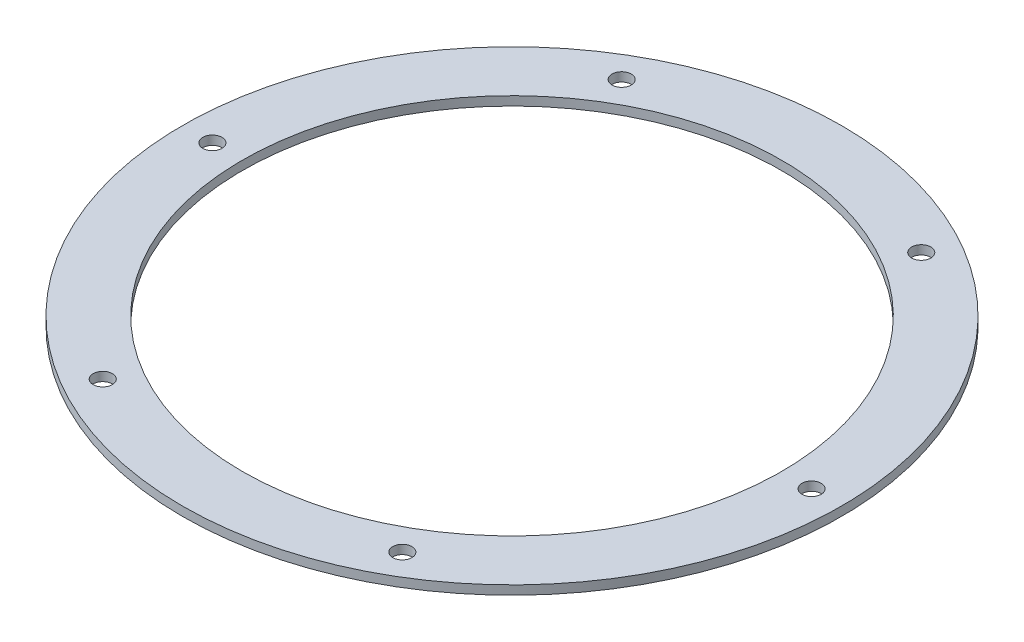
ISO-10303-21;
HEADER;
FILE_DESCRIPTION(('STEP AP214'),'2;1');
FILE_NAME('part.step','',(''),(''),'','','');
FILE_SCHEMA(('AUTOMOTIVE_DESIGN { 1 0 10303 214 1 1 1 1 }'));
ENDSEC;
DATA;
#1=APPLICATION_CONTEXT('core data for automotive mechanical design processes');
#2=APPLICATION_PROTOCOL_DEFINITION('international standard','automotive_design',2000,#1);
#3=PRODUCT_CONTEXT('',#1,'mechanical');
#4=PRODUCT('Part','Part','',(#3));
#5=PRODUCT_RELATED_PRODUCT_CATEGORY('part','',(#4));
#6=PRODUCT_DEFINITION_FORMATION('','',#4);
#7=PRODUCT_DEFINITION_CONTEXT('part definition',#1,'design');
#8=PRODUCT_DEFINITION('design','',#6,#7);
#9=PRODUCT_DEFINITION_SHAPE('','',#8);
#10=(LENGTH_UNIT() NAMED_UNIT(*) SI_UNIT(.MILLI.,.METRE.));
#11=(NAMED_UNIT(*) PLANE_ANGLE_UNIT() SI_UNIT($,.RADIAN.));
#12=(NAMED_UNIT(*) SI_UNIT($,.STERADIAN.) SOLID_ANGLE_UNIT());
#13=UNCERTAINTY_MEASURE_WITH_UNIT(LENGTH_MEASURE(1.E-05),#10,'distance_accuracy_value','');
#14=(GEOMETRIC_REPRESENTATION_CONTEXT(3) GLOBAL_UNCERTAINTY_ASSIGNED_CONTEXT((#13)) GLOBAL_UNIT_ASSIGNED_CONTEXT((#10,
#11,#12)) REPRESENTATION_CONTEXT('',''));
#15=CARTESIAN_POINT('',(0.,0.,0.));
#16=DIRECTION('',(0.,0.,1.));
#17=DIRECTION('',(1.,0.,0.));
#18=AXIS2_PLACEMENT_3D('',#15,#16,#17);
#19=CARTESIAN_POINT('',(0.,1.5,0.));
#20=DIRECTION('',(0.,1.,0.));
#21=DIRECTION('',(0.,0.,1.));
#22=AXIS2_PLACEMENT_3D('',#19,#20,#21);
#23=PLANE('',#22);
#24=CARTESIAN_POINT('',(-25.,1.5,-43.3012701892219));
#25=DIRECTION('',(0.,1.,0.));
#26=DIRECTION('',(0.,0.,1.));
#27=AXIS2_PLACEMENT_3D('',#24,#25,#26);
#28=CIRCLE('',#27,1.6);
#29=CARTESIAN_POINT('',(-25.,1.5,-41.7012701892219));
#30=VERTEX_POINT('',#29);
#31=EDGE_CURVE('E81',#30,#30,#28,.T.);
#32=ORIENTED_EDGE('',*,*,#31,.F.);
#33=EDGE_LOOP('',(#32));
#34=FACE_BOUND('',#33,.T.);
#35=CARTESIAN_POINT('',(-25.,1.5,43.3012701892219));
#36=DIRECTION('',(0.,1.,0.));
#37=DIRECTION('',(0.,0.,1.));
#38=AXIS2_PLACEMENT_3D('',#35,#36,#37);
#39=CIRCLE('',#38,1.6);
#40=CARTESIAN_POINT('',(-25.,1.5,44.9012701892219));
#41=VERTEX_POINT('',#40);
#42=EDGE_CURVE('E69',#41,#41,#39,.T.);
#43=ORIENTED_EDGE('',*,*,#42,.F.);
#44=EDGE_LOOP('',(#43));
#45=FACE_BOUND('',#44,.T.);
#46=CARTESIAN_POINT('',(50.,1.5,0.));
#47=DIRECTION('',(0.,1.,0.));
#48=DIRECTION('',(0.,0.,1.));
#49=AXIS2_PLACEMENT_3D('',#46,#47,#48);
#50=CIRCLE('',#49,1.6);
#51=CARTESIAN_POINT('',(50.,1.5,1.6));
#52=VERTEX_POINT('',#51);
#53=EDGE_CURVE('E57',#52,#52,#50,.T.);
#54=ORIENTED_EDGE('',*,*,#53,.F.);
#55=EDGE_LOOP('',(#54));
#56=FACE_BOUND('',#55,.T.);
#57=CARTESIAN_POINT('',(0.,1.5,0.));
#58=DIRECTION('',(0.,1.,0.));
#59=DIRECTION('',(0.,0.,1.));
#60=AXIS2_PLACEMENT_3D('',#57,#58,#59);
#61=CIRCLE('',#60,55.);
#62=CARTESIAN_POINT('',(0.,1.5,55.));
#63=VERTEX_POINT('',#62);
#64=EDGE_CURVE('E10',#63,#63,#61,.T.);
#65=ORIENTED_EDGE('',*,*,#64,.T.);
#66=EDGE_LOOP('',(#65));
#67=FACE_BOUND('',#66,.T.);
#68=CARTESIAN_POINT('',(0.,1.5,0.));
#69=DIRECTION('',(0.,1.,0.));
#70=DIRECTION('',(0.,0.,1.));
#71=AXIS2_PLACEMENT_3D('',#68,#69,#70);
#72=CIRCLE('',#71,45.);
#73=CARTESIAN_POINT('',(0.,1.5,45.));
#74=VERTEX_POINT('',#73);
#75=EDGE_CURVE('E52',#74,#74,#72,.T.);
#76=ORIENTED_EDGE('',*,*,#75,.F.);
#77=EDGE_LOOP('',(#76));
#78=FACE_BOUND('',#77,.T.);
#79=CARTESIAN_POINT('',(25.,1.5,43.3012701892219));
#80=DIRECTION('',(0.,1.,0.));
#81=DIRECTION('',(0.,0.,1.));
#82=AXIS2_PLACEMENT_3D('',#79,#80,#81);
#83=CIRCLE('',#82,1.6);
#84=CARTESIAN_POINT('',(25.,1.5,44.9012701892219));
#85=VERTEX_POINT('',#84);
#86=EDGE_CURVE('E63',#85,#85,#83,.T.);
#87=ORIENTED_EDGE('',*,*,#86,.F.);
#88=EDGE_LOOP('',(#87));
#89=FACE_BOUND('',#88,.T.);
#90=CARTESIAN_POINT('',(-50.,1.5,0.));
#91=DIRECTION('',(0.,1.,0.));
#92=DIRECTION('',(0.,0.,1.));
#93=AXIS2_PLACEMENT_3D('',#90,#91,#92);
#94=CIRCLE('',#93,1.6);
#95=CARTESIAN_POINT('',(-50.,1.5,1.59999999999999));
#96=VERTEX_POINT('',#95);
#97=EDGE_CURVE('E75',#96,#96,#94,.T.);
#98=ORIENTED_EDGE('',*,*,#97,.F.);
#99=EDGE_LOOP('',(#98));
#100=FACE_BOUND('',#99,.T.);
#101=CARTESIAN_POINT('',(25.,1.5,-43.3012701892219));
#102=DIRECTION('',(0.,1.,0.));
#103=DIRECTION('',(0.,0.,1.));
#104=AXIS2_PLACEMENT_3D('',#101,#102,#103);
#105=CIRCLE('',#104,1.6);
#106=CARTESIAN_POINT('',(25.,1.5,-41.7012701892219));
#107=VERTEX_POINT('',#106);
#108=EDGE_CURVE('E87',#107,#107,#105,.T.);
#109=ORIENTED_EDGE('',*,*,#108,.F.);
#110=EDGE_LOOP('',(#109));
#111=FACE_BOUND('',#110,.T.);
#112=ADVANCED_FACE('F41',(#34,#45,#56,#67,#78,#89,#100,#111),#23,.T.);
#113=CARTESIAN_POINT('',(0.,0.,0.));
#114=DIRECTION('',(0.,1.,0.));
#115=DIRECTION('',(0.,0.,1.));
#116=AXIS2_PLACEMENT_3D('',#113,#114,#115);
#117=PLANE('',#116);
#118=CARTESIAN_POINT('',(0.,0.,0.));
#119=DIRECTION('',(0.,1.,0.));
#120=DIRECTION('',(0.,0.,1.));
#121=AXIS2_PLACEMENT_3D('',#118,#119,#120);
#122=CIRCLE('',#121,55.);
#123=CARTESIAN_POINT('',(0.,0.,55.));
#124=VERTEX_POINT('',#123);
#125=EDGE_CURVE('E45',#124,#124,#122,.T.);
#126=ORIENTED_EDGE('',*,*,#125,.F.);
#127=EDGE_LOOP('',(#126));
#128=FACE_BOUND('',#127,.T.);
#129=CARTESIAN_POINT('',(0.,0.,0.));
#130=DIRECTION('',(0.,1.,0.));
#131=DIRECTION('',(0.,0.,1.));
#132=AXIS2_PLACEMENT_3D('',#129,#130,#131);
#133=CIRCLE('',#132,45.);
#134=CARTESIAN_POINT('',(0.,0.,45.));
#135=VERTEX_POINT('',#134);
#136=EDGE_CURVE('E54',#135,#135,#133,.T.);
#137=ORIENTED_EDGE('',*,*,#136,.T.);
#138=EDGE_LOOP('',(#137));
#139=FACE_BOUND('',#138,.T.);
#140=CARTESIAN_POINT('',(50.,0.,0.));
#141=DIRECTION('',(0.,1.,0.));
#142=DIRECTION('',(0.,0.,1.));
#143=AXIS2_PLACEMENT_3D('',#140,#141,#142);
#144=CIRCLE('',#143,1.6);
#145=CARTESIAN_POINT('',(50.,0.,1.6));
#146=VERTEX_POINT('',#145);
#147=EDGE_CURVE('E60',#146,#146,#144,.T.);
#148=ORIENTED_EDGE('',*,*,#147,.T.);
#149=EDGE_LOOP('',(#148));
#150=FACE_BOUND('',#149,.T.);
#151=CARTESIAN_POINT('',(25.,0.,43.3012701892219));
#152=DIRECTION('',(0.,1.,0.));
#153=DIRECTION('',(0.,0.,1.));
#154=AXIS2_PLACEMENT_3D('',#151,#152,#153);
#155=CIRCLE('',#154,1.6);
#156=CARTESIAN_POINT('',(25.,0.,44.9012701892219));
#157=VERTEX_POINT('',#156);
#158=EDGE_CURVE('E66',#157,#157,#155,.T.);
#159=ORIENTED_EDGE('',*,*,#158,.T.);
#160=EDGE_LOOP('',(#159));
#161=FACE_BOUND('',#160,.T.);
#162=CARTESIAN_POINT('',(-25.,0.,43.3012701892219));
#163=DIRECTION('',(0.,1.,0.));
#164=DIRECTION('',(0.,0.,1.));
#165=AXIS2_PLACEMENT_3D('',#162,#163,#164);
#166=CIRCLE('',#165,1.6);
#167=CARTESIAN_POINT('',(-25.,0.,44.9012701892219));
#168=VERTEX_POINT('',#167);
#169=EDGE_CURVE('E72',#168,#168,#166,.T.);
#170=ORIENTED_EDGE('',*,*,#169,.T.);
#171=EDGE_LOOP('',(#170));
#172=FACE_BOUND('',#171,.T.);
#173=CARTESIAN_POINT('',(-50.,0.,0.));
#174=DIRECTION('',(0.,1.,0.));
#175=DIRECTION('',(0.,0.,1.));
#176=AXIS2_PLACEMENT_3D('',#173,#174,#175);
#177=CIRCLE('',#176,1.6);
#178=CARTESIAN_POINT('',(-50.,0.,1.59999999999999));
#179=VERTEX_POINT('',#178);
#180=EDGE_CURVE('E78',#179,#179,#177,.T.);
#181=ORIENTED_EDGE('',*,*,#180,.T.);
#182=EDGE_LOOP('',(#181));
#183=FACE_BOUND('',#182,.T.);
#184=CARTESIAN_POINT('',(-25.,0.,-43.3012701892219));
#185=DIRECTION('',(0.,1.,0.));
#186=DIRECTION('',(0.,0.,1.));
#187=AXIS2_PLACEMENT_3D('',#184,#185,#186);
#188=CIRCLE('',#187,1.6);
#189=CARTESIAN_POINT('',(-25.,0.,-41.7012701892219));
#190=VERTEX_POINT('',#189);
#191=EDGE_CURVE('E84',#190,#190,#188,.T.);
#192=ORIENTED_EDGE('',*,*,#191,.T.);
#193=EDGE_LOOP('',(#192));
#194=FACE_BOUND('',#193,.T.);
#195=CARTESIAN_POINT('',(25.,0.,-43.3012701892219));
#196=DIRECTION('',(0.,1.,0.));
#197=DIRECTION('',(0.,0.,1.));
#198=AXIS2_PLACEMENT_3D('',#195,#196,#197);
#199=CIRCLE('',#198,1.6);
#200=CARTESIAN_POINT('',(25.,0.,-41.7012701892219));
#201=VERTEX_POINT('',#200);
#202=EDGE_CURVE('E90',#201,#201,#199,.T.);
#203=ORIENTED_EDGE('',*,*,#202,.T.);
#204=EDGE_LOOP('',(#203));
#205=FACE_BOUND('',#204,.T.);
#206=ADVANCED_FACE('F100',(#128,#139,#150,#161,#172,#183,#194,#205),#117,.F.);
#207=CARTESIAN_POINT('',(0.,1.5,0.));
#208=DIRECTION('',(0.,-1.,0.));
#209=DIRECTION('',(0.,0.,-1.));
#210=AXIS2_PLACEMENT_3D('',#207,#208,#209);
#211=CYLINDRICAL_SURFACE('',#210,55.);
#212=ORIENTED_EDGE('',*,*,#64,.F.);
#213=EDGE_LOOP('',(#212));
#214=FACE_BOUND('',#213,.T.);
#215=ORIENTED_EDGE('',*,*,#125,.T.);
#216=EDGE_LOOP('',(#215));
#217=FACE_BOUND('',#216,.T.);
#218=ADVANCED_FACE('F43',(#214,#217),#211,.T.);
#219=CARTESIAN_POINT('',(0.,1.5,0.));
#220=DIRECTION('',(0.,-1.,0.));
#221=DIRECTION('',(0.,0.,-1.));
#222=AXIS2_PLACEMENT_3D('',#219,#220,#221);
#223=CYLINDRICAL_SURFACE('',#222,45.);
#224=ORIENTED_EDGE('',*,*,#75,.T.);
#225=EDGE_LOOP('',(#224));
#226=FACE_BOUND('',#225,.T.);
#227=ORIENTED_EDGE('',*,*,#136,.F.);
#228=EDGE_LOOP('',(#227));
#229=FACE_BOUND('',#228,.T.);
#230=ADVANCED_FACE('F110',(#226,#229),#223,.F.);
#231=CARTESIAN_POINT('',(50.,1.5,0.));
#232=DIRECTION('',(0.,-1.,0.));
#233=DIRECTION('',(0.,0.,-1.));
#234=AXIS2_PLACEMENT_3D('',#231,#232,#233);
#235=CYLINDRICAL_SURFACE('',#234,1.6);
#236=ORIENTED_EDGE('',*,*,#53,.T.);
#237=EDGE_LOOP('',(#236));
#238=FACE_BOUND('',#237,.T.);
#239=ORIENTED_EDGE('',*,*,#147,.F.);
#240=EDGE_LOOP('',(#239));
#241=FACE_BOUND('',#240,.T.);
#242=ADVANCED_FACE('F113',(#238,#241),#235,.F.);
#243=CARTESIAN_POINT('',(25.,1.5,43.3012701892219));
#244=DIRECTION('',(0.,-1.,0.));
#245=DIRECTION('',(0.,0.,-1.));
#246=AXIS2_PLACEMENT_3D('',#243,#244,#245);
#247=CYLINDRICAL_SURFACE('',#246,1.6);
#248=ORIENTED_EDGE('',*,*,#86,.T.);
#249=EDGE_LOOP('',(#248));
#250=FACE_BOUND('',#249,.T.);
#251=ORIENTED_EDGE('',*,*,#158,.F.);
#252=EDGE_LOOP('',(#251));
#253=FACE_BOUND('',#252,.T.);
#254=ADVANCED_FACE('F117',(#250,#253),#247,.F.);
#255=CARTESIAN_POINT('',(-25.,1.5,43.3012701892219));
#256=DIRECTION('',(0.,-1.,0.));
#257=DIRECTION('',(0.,0.,-1.));
#258=AXIS2_PLACEMENT_3D('',#255,#256,#257);
#259=CYLINDRICAL_SURFACE('',#258,1.6);
#260=ORIENTED_EDGE('',*,*,#42,.T.);
#261=EDGE_LOOP('',(#260));
#262=FACE_BOUND('',#261,.T.);
#263=ORIENTED_EDGE('',*,*,#169,.F.);
#264=EDGE_LOOP('',(#263));
#265=FACE_BOUND('',#264,.T.);
#266=ADVANCED_FACE('F121',(#262,#265),#259,.F.);
#267=CARTESIAN_POINT('',(-50.,1.5,0.));
#268=DIRECTION('',(0.,-1.,0.));
#269=DIRECTION('',(0.,0.,-1.));
#270=AXIS2_PLACEMENT_3D('',#267,#268,#269);
#271=CYLINDRICAL_SURFACE('',#270,1.6);
#272=ORIENTED_EDGE('',*,*,#97,.T.);
#273=EDGE_LOOP('',(#272));
#274=FACE_BOUND('',#273,.T.);
#275=ORIENTED_EDGE('',*,*,#180,.F.);
#276=EDGE_LOOP('',(#275));
#277=FACE_BOUND('',#276,.T.);
#278=ADVANCED_FACE('F125',(#274,#277),#271,.F.);
#279=CARTESIAN_POINT('',(-25.,1.5,-43.3012701892219));
#280=DIRECTION('',(0.,-1.,0.));
#281=DIRECTION('',(0.,0.,-1.));
#282=AXIS2_PLACEMENT_3D('',#279,#280,#281);
#283=CYLINDRICAL_SURFACE('',#282,1.6);
#284=ORIENTED_EDGE('',*,*,#31,.T.);
#285=EDGE_LOOP('',(#284));
#286=FACE_BOUND('',#285,.T.);
#287=ORIENTED_EDGE('',*,*,#191,.F.);
#288=EDGE_LOOP('',(#287));
#289=FACE_BOUND('',#288,.T.);
#290=ADVANCED_FACE('F129',(#286,#289),#283,.F.);
#291=CARTESIAN_POINT('',(25.,1.5,-43.3012701892219));
#292=DIRECTION('',(0.,-1.,0.));
#293=DIRECTION('',(0.,0.,-1.));
#294=AXIS2_PLACEMENT_3D('',#291,#292,#293);
#295=CYLINDRICAL_SURFACE('',#294,1.6);
#296=ORIENTED_EDGE('',*,*,#108,.T.);
#297=EDGE_LOOP('',(#296));
#298=FACE_BOUND('',#297,.T.);
#299=ORIENTED_EDGE('',*,*,#202,.F.);
#300=EDGE_LOOP('',(#299));
#301=FACE_BOUND('',#300,.T.);
#302=ADVANCED_FACE('F96',(#298,#301),#295,.F.);
#303=CLOSED_SHELL('',(#112,#206,#218,#230,#242,#254,#266,#278,#290,#302));
#304=MANIFOLD_SOLID_BREP('B2',#303);
#305=ADVANCED_BREP_SHAPE_REPRESENTATION('',(#18,#304),#14);
#306=SHAPE_DEFINITION_REPRESENTATION(#9,#305);
ENDSEC;
END-ISO-10303-21;
